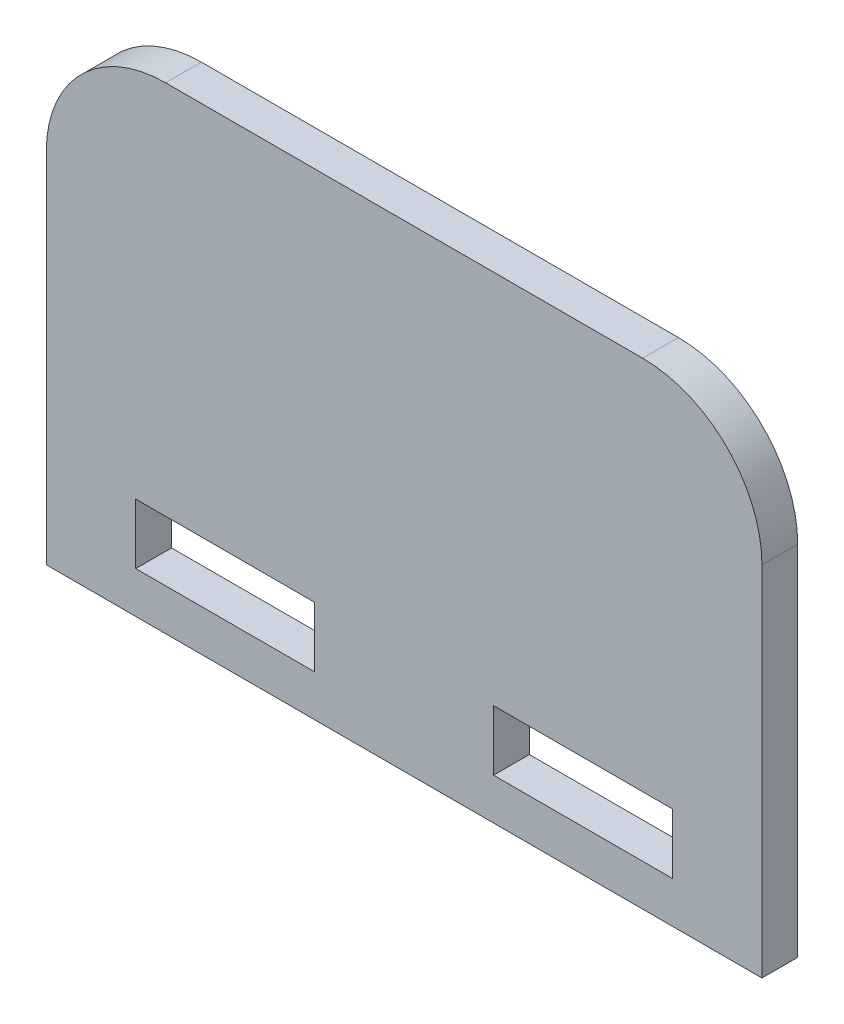
ISO-10303-21;
HEADER;
FILE_DESCRIPTION(('STEP AP214'),'2;1');
FILE_NAME('part.step','',(''),(''),'','','');
FILE_SCHEMA(('AUTOMOTIVE_DESIGN { 1 0 10303 214 1 1 1 1 }'));
ENDSEC;
DATA;
#1=APPLICATION_CONTEXT('core data for automotive mechanical design processes');
#2=APPLICATION_PROTOCOL_DEFINITION('international standard','automotive_design',2000,#1);
#3=PRODUCT_CONTEXT('',#1,'mechanical');
#4=PRODUCT('Part','Part','',(#3));
#5=PRODUCT_RELATED_PRODUCT_CATEGORY('part','',(#4));
#6=PRODUCT_DEFINITION_FORMATION('','',#4);
#7=PRODUCT_DEFINITION_CONTEXT('part definition',#1,'design');
#8=PRODUCT_DEFINITION('design','',#6,#7);
#9=PRODUCT_DEFINITION_SHAPE('','',#8);
#10=(LENGTH_UNIT() NAMED_UNIT(*) SI_UNIT(.MILLI.,.METRE.));
#11=(NAMED_UNIT(*) PLANE_ANGLE_UNIT() SI_UNIT($,.RADIAN.));
#12=(NAMED_UNIT(*) SI_UNIT($,.STERADIAN.) SOLID_ANGLE_UNIT());
#13=UNCERTAINTY_MEASURE_WITH_UNIT(LENGTH_MEASURE(1.E-05),#10,'distance_accuracy_value','');
#14=(GEOMETRIC_REPRESENTATION_CONTEXT(3) GLOBAL_UNCERTAINTY_ASSIGNED_CONTEXT((#13)) GLOBAL_UNIT_ASSIGNED_CONTEXT((#10,
#11,#12)) REPRESENTATION_CONTEXT('',''));
#15=CARTESIAN_POINT('',(0.,0.,0.));
#16=DIRECTION('',(0.,0.,1.));
#17=DIRECTION('',(1.,0.,0.));
#18=AXIS2_PLACEMENT_3D('',#15,#16,#17);
#19=CARTESIAN_POINT('',(-20.,10.,3.));
#20=DIRECTION('',(0.,0.,1.));
#21=DIRECTION('',(1.,0.,0.));
#22=AXIS2_PLACEMENT_3D('',#19,#20,#21);
#23=PLANE('',#22);
#24=DIRECTION('',(0.,1.,0.));
#25=VECTOR('',#24,1.);
#26=CARTESIAN_POINT('',(30.,9.99999999999993,3.));
#27=LINE('',#26,#25);
#28=CARTESIAN_POINT('',(30.,-20.,3.));
#29=VERTEX_POINT('',#28);
#30=CARTESIAN_POINT('',(30.,9.99999999999994,3.));
#31=VERTEX_POINT('',#30);
#32=EDGE_CURVE('E207',#29,#31,#27,.T.);
#33=ORIENTED_EDGE('',*,*,#32,.T.);
#34=CARTESIAN_POINT('',(20.,10.,3.));
#35=DIRECTION('',(0.,0.,1.));
#36=DIRECTION('',(-1.,0.,0.));
#37=AXIS2_PLACEMENT_3D('',#34,#35,#36);
#38=CIRCLE('',#37,10.);
#39=CARTESIAN_POINT('',(19.9999999999999,20.,3.));
#40=VERTEX_POINT('',#39);
#41=EDGE_CURVE('E210',#31,#40,#38,.T.);
#42=ORIENTED_EDGE('',*,*,#41,.T.);
#43=DIRECTION('',(-1.,0.,0.));
#44=VECTOR('',#43,1.);
#45=CARTESIAN_POINT('',(-19.9999999999999,20.,3.));
#46=LINE('',#45,#44);
#47=CARTESIAN_POINT('',(-19.9999999999999,20.,3.));
#48=VERTEX_POINT('',#47);
#49=EDGE_CURVE('E213',#40,#48,#46,.T.);
#50=ORIENTED_EDGE('',*,*,#49,.T.);
#51=CARTESIAN_POINT('',(-20.,10.,3.));
#52=DIRECTION('',(0.,0.,1.));
#53=DIRECTION('',(1.,0.,0.));
#54=AXIS2_PLACEMENT_3D('',#51,#52,#53);
#55=CIRCLE('',#54,10.);
#56=CARTESIAN_POINT('',(-30.,9.99999999999993,3.));
#57=VERTEX_POINT('',#56);
#58=EDGE_CURVE('E215',#48,#57,#55,.T.);
#59=ORIENTED_EDGE('',*,*,#58,.T.);
#60=DIRECTION('',(0.,-1.,0.));
#61=VECTOR('',#60,1.);
#62=CARTESIAN_POINT('',(-30.,9.99999999999993,3.));
#63=LINE('',#62,#61);
#64=CARTESIAN_POINT('',(-30.,-20.,3.));
#65=VERTEX_POINT('',#64);
#66=EDGE_CURVE('E217',#57,#65,#63,.T.);
#67=ORIENTED_EDGE('',*,*,#66,.T.);
#68=DIRECTION('',(1.,0.,0.));
#69=VECTOR('',#68,1.);
#70=CARTESIAN_POINT('',(-30.,-20.,3.));
#71=LINE('',#70,#69);
#72=EDGE_CURVE('E219',#65,#29,#71,.T.);
#73=ORIENTED_EDGE('',*,*,#72,.T.);
#74=EDGE_LOOP('',(#33,#42,#50,#59,#67,#73));
#75=FACE_BOUND('',#74,.T.);
#76=DIRECTION('',(-1.,0.,0.));
#77=VECTOR('',#76,1.);
#78=CARTESIAN_POINT('',(22.5,-11.475,3.));
#79=LINE('',#78,#77);
#80=CARTESIAN_POINT('',(22.5,-11.475,3.));
#81=VERTEX_POINT('',#80);
#82=CARTESIAN_POINT('',(7.49999999999999,-11.475,3.));
#83=VERTEX_POINT('',#82);
#84=EDGE_CURVE('E178',#81,#83,#79,.T.);
#85=ORIENTED_EDGE('',*,*,#84,.F.);
#86=DIRECTION('',(0.,1.,0.));
#87=VECTOR('',#86,1.);
#88=CARTESIAN_POINT('',(22.5,-11.475,3.));
#89=LINE('',#88,#87);
#90=CARTESIAN_POINT('',(22.5,-16.525,3.));
#91=VERTEX_POINT('',#90);
#92=EDGE_CURVE('E176',#91,#81,#89,.T.);
#93=ORIENTED_EDGE('',*,*,#92,.F.);
#94=DIRECTION('',(1.,0.,0.));
#95=VECTOR('',#94,1.);
#96=CARTESIAN_POINT('',(22.5,-16.525,3.));
#97=LINE('',#96,#95);
#98=CARTESIAN_POINT('',(7.5,-16.525,3.));
#99=VERTEX_POINT('',#98);
#100=EDGE_CURVE('E184',#99,#91,#97,.T.);
#101=ORIENTED_EDGE('',*,*,#100,.F.);
#102=DIRECTION('',(0.,-1.,0.));
#103=VECTOR('',#102,1.);
#104=CARTESIAN_POINT('',(7.49999999999999,-11.475,3.));
#105=LINE('',#104,#103);
#106=EDGE_CURVE('E181',#83,#99,#105,.T.);
#107=ORIENTED_EDGE('',*,*,#106,.F.);
#108=EDGE_LOOP('',(#85,#93,#101,#107));
#109=FACE_BOUND('',#108,.T.);
#110=DIRECTION('',(-1.,0.,0.));
#111=VECTOR('',#110,1.);
#112=CARTESIAN_POINT('',(-22.5,-11.475,3.));
#113=LINE('',#112,#111);
#114=CARTESIAN_POINT('',(-7.49999999999999,-11.475,3.));
#115=VERTEX_POINT('',#114);
#116=CARTESIAN_POINT('',(-22.5,-11.475,3.));
#117=VERTEX_POINT('',#116);
#118=EDGE_CURVE('E148',#115,#117,#113,.T.);
#119=ORIENTED_EDGE('',*,*,#118,.F.);
#120=DIRECTION('',(0.,1.,0.));
#121=VECTOR('',#120,1.);
#122=CARTESIAN_POINT('',(-7.49999999999999,-11.475,3.));
#123=LINE('',#122,#121);
#124=CARTESIAN_POINT('',(-7.49999999999999,-16.525,3.));
#125=VERTEX_POINT('',#124);
#126=EDGE_CURVE('E140',#125,#115,#123,.T.);
#127=ORIENTED_EDGE('',*,*,#126,.F.);
#128=DIRECTION('',(1.,0.,0.));
#129=VECTOR('',#128,1.);
#130=CARTESIAN_POINT('',(-22.5,-16.525,3.));
#131=LINE('',#130,#129);
#132=CARTESIAN_POINT('',(-22.5,-16.525,3.));
#133=VERTEX_POINT('',#132);
#134=EDGE_CURVE('E162',#133,#125,#131,.T.);
#135=ORIENTED_EDGE('',*,*,#134,.F.);
#136=DIRECTION('',(0.,-1.,0.));
#137=VECTOR('',#136,1.);
#138=CARTESIAN_POINT('',(-22.5,-11.475,3.));
#139=LINE('',#138,#137);
#140=EDGE_CURVE('E160',#117,#133,#139,.T.);
#141=ORIENTED_EDGE('',*,*,#140,.F.);
#142=EDGE_LOOP('',(#119,#127,#135,#141));
#143=FACE_BOUND('',#142,.T.);
#144=ADVANCED_FACE('F39',(#75,#109,#143),#23,.T.);
#145=CARTESIAN_POINT('',(-20.,10.,0.));
#146=DIRECTION('',(0.,0.,1.));
#147=DIRECTION('',(1.,0.,0.));
#148=AXIS2_PLACEMENT_3D('',#145,#146,#147);
#149=PLANE('',#148);
#150=DIRECTION('',(0.,1.,0.));
#151=VECTOR('',#150,1.);
#152=CARTESIAN_POINT('',(22.5,-11.475,0.));
#153=LINE('',#152,#151);
#154=CARTESIAN_POINT('',(22.5,-16.525,0.));
#155=VERTEX_POINT('',#154);
#156=CARTESIAN_POINT('',(22.5,-11.475,0.));
#157=VERTEX_POINT('',#156);
#158=EDGE_CURVE('E156',#155,#157,#153,.T.);
#159=ORIENTED_EDGE('',*,*,#158,.T.);
#160=DIRECTION('',(-1.,0.,0.));
#161=VECTOR('',#160,1.);
#162=CARTESIAN_POINT('',(22.5,-11.475,0.));
#163=LINE('',#162,#161);
#164=CARTESIAN_POINT('',(7.49999999999999,-11.475,0.));
#165=VERTEX_POINT('',#164);
#166=EDGE_CURVE('E189',#157,#165,#163,.T.);
#167=ORIENTED_EDGE('',*,*,#166,.T.);
#168=DIRECTION('',(0.,-1.,0.));
#169=VECTOR('',#168,1.);
#170=CARTESIAN_POINT('',(7.49999999999999,-11.475,0.));
#171=LINE('',#170,#169);
#172=CARTESIAN_POINT('',(7.5,-16.525,0.));
#173=VERTEX_POINT('',#172);
#174=EDGE_CURVE('E192',#165,#173,#171,.T.);
#175=ORIENTED_EDGE('',*,*,#174,.T.);
#176=DIRECTION('',(1.,0.,0.));
#177=VECTOR('',#176,1.);
#178=CARTESIAN_POINT('',(22.5,-16.525,0.));
#179=LINE('',#178,#177);
#180=EDGE_CURVE('E179',#173,#155,#179,.T.);
#181=ORIENTED_EDGE('',*,*,#180,.T.);
#182=EDGE_LOOP('',(#159,#167,#175,#181));
#183=FACE_BOUND('',#182,.T.);
#184=DIRECTION('',(0.,1.,0.));
#185=VECTOR('',#184,1.);
#186=CARTESIAN_POINT('',(30.,9.99999999999993,0.));
#187=LINE('',#186,#185);
#188=CARTESIAN_POINT('',(30.,-20.,0.));
#189=VERTEX_POINT('',#188);
#190=CARTESIAN_POINT('',(30.,9.99999999999994,0.));
#191=VERTEX_POINT('',#190);
#192=EDGE_CURVE('E206',#189,#191,#187,.T.);
#193=ORIENTED_EDGE('',*,*,#192,.F.);
#194=DIRECTION('',(1.,0.,0.));
#195=VECTOR('',#194,1.);
#196=CARTESIAN_POINT('',(-30.,-20.,0.));
#197=LINE('',#196,#195);
#198=CARTESIAN_POINT('',(-30.,-20.,0.));
#199=VERTEX_POINT('',#198);
#200=EDGE_CURVE('E211',#199,#189,#197,.T.);
#201=ORIENTED_EDGE('',*,*,#200,.F.);
#202=DIRECTION('',(0.,-1.,0.));
#203=VECTOR('',#202,1.);
#204=CARTESIAN_POINT('',(-30.,9.99999999999993,0.));
#205=LINE('',#204,#203);
#206=CARTESIAN_POINT('',(-30.,9.99999999999993,0.));
#207=VERTEX_POINT('',#206);
#208=EDGE_CURVE('E230',#207,#199,#205,.T.);
#209=ORIENTED_EDGE('',*,*,#208,.F.);
#210=CARTESIAN_POINT('',(-20.,10.,0.));
#211=DIRECTION('',(0.,0.,1.));
#212=DIRECTION('',(1.,0.,0.));
#213=AXIS2_PLACEMENT_3D('',#210,#211,#212);
#214=CIRCLE('',#213,10.);
#215=CARTESIAN_POINT('',(-19.9999999999999,20.,0.));
#216=VERTEX_POINT('',#215);
#217=EDGE_CURVE('E228',#216,#207,#214,.T.);
#218=ORIENTED_EDGE('',*,*,#217,.F.);
#219=DIRECTION('',(-1.,0.,0.));
#220=VECTOR('',#219,1.);
#221=CARTESIAN_POINT('',(-19.9999999999999,20.,0.));
#222=LINE('',#221,#220);
#223=CARTESIAN_POINT('',(19.9999999999999,20.,0.));
#224=VERTEX_POINT('',#223);
#225=EDGE_CURVE('E226',#224,#216,#222,.T.);
#226=ORIENTED_EDGE('',*,*,#225,.F.);
#227=CARTESIAN_POINT('',(20.,10.,0.));
#228=DIRECTION('',(0.,0.,1.));
#229=DIRECTION('',(-1.,0.,0.));
#230=AXIS2_PLACEMENT_3D('',#227,#228,#229);
#231=CIRCLE('',#230,10.);
#232=EDGE_CURVE('E224',#191,#224,#231,.T.);
#233=ORIENTED_EDGE('',*,*,#232,.F.);
#234=EDGE_LOOP('',(#193,#201,#209,#218,#226,#233));
#235=FACE_BOUND('',#234,.T.);
#236=DIRECTION('',(0.,1.,0.));
#237=VECTOR('',#236,1.);
#238=CARTESIAN_POINT('',(-7.49999999999999,-11.475,0.));
#239=LINE('',#238,#237);
#240=CARTESIAN_POINT('',(-7.49999999999999,-16.525,0.));
#241=VERTEX_POINT('',#240);
#242=CARTESIAN_POINT('',(-7.49999999999999,-11.475,0.));
#243=VERTEX_POINT('',#242);
#244=EDGE_CURVE('E62',#241,#243,#239,.T.);
#245=ORIENTED_EDGE('',*,*,#244,.T.);
#246=DIRECTION('',(-1.,0.,0.));
#247=VECTOR('',#246,1.);
#248=CARTESIAN_POINT('',(-22.5,-11.475,0.));
#249=LINE('',#248,#247);
#250=CARTESIAN_POINT('',(-22.5,-11.475,0.));
#251=VERTEX_POINT('',#250);
#252=EDGE_CURVE('E155',#243,#251,#249,.T.);
#253=ORIENTED_EDGE('',*,*,#252,.T.);
#254=DIRECTION('',(0.,-1.,0.));
#255=VECTOR('',#254,1.);
#256=CARTESIAN_POINT('',(-22.5,-11.475,0.));
#257=LINE('',#256,#255);
#258=CARTESIAN_POINT('',(-22.5,-16.525,0.));
#259=VERTEX_POINT('',#258);
#260=EDGE_CURVE('E168',#251,#259,#257,.T.);
#261=ORIENTED_EDGE('',*,*,#260,.T.);
#262=DIRECTION('',(1.,0.,0.));
#263=VECTOR('',#262,1.);
#264=CARTESIAN_POINT('',(-22.5,-16.525,0.));
#265=LINE('',#264,#263);
#266=EDGE_CURVE('E149',#259,#241,#265,.T.);
#267=ORIENTED_EDGE('',*,*,#266,.T.);
#268=EDGE_LOOP('',(#245,#253,#261,#267));
#269=FACE_BOUND('',#268,.T.);
#270=ADVANCED_FACE('F254',(#183,#235,#269),#149,.F.);
#271=CARTESIAN_POINT('',(30.,9.99999999999993,3.));
#272=DIRECTION('',(-1.,0.,0.));
#273=DIRECTION('',(0.,-1.,0.));
#274=AXIS2_PLACEMENT_3D('',#271,#272,#273);
#275=PLANE('',#274);
#276=ORIENTED_EDGE('',*,*,#192,.T.);
#277=DIRECTION('',(0.,0.,-1.));
#278=VECTOR('',#277,1.);
#279=CARTESIAN_POINT('',(30.,9.99999999999994,3.));
#280=LINE('',#279,#278);
#281=EDGE_CURVE('E11',#31,#191,#280,.T.);
#282=ORIENTED_EDGE('',*,*,#281,.F.);
#283=ORIENTED_EDGE('',*,*,#32,.F.);
#284=DIRECTION('',(0.,0.,-1.));
#285=VECTOR('',#284,1.);
#286=CARTESIAN_POINT('',(30.,-20.,3.));
#287=LINE('',#286,#285);
#288=EDGE_CURVE('E221',#29,#189,#287,.T.);
#289=ORIENTED_EDGE('',*,*,#288,.T.);
#290=EDGE_LOOP('',(#276,#282,#283,#289));
#291=FACE_BOUND('',#290,.T.);
#292=ADVANCED_FACE('F41',(#291),#275,.F.);
#293=CARTESIAN_POINT('',(20.,10.,3.));
#294=DIRECTION('',(0.,0.,-1.));
#295=DIRECTION('',(-1.,0.,0.));
#296=AXIS2_PLACEMENT_3D('',#293,#294,#295);
#297=CYLINDRICAL_SURFACE('',#296,10.);
#298=ORIENTED_EDGE('',*,*,#232,.T.);
#299=DIRECTION('',(0.,0.,-1.));
#300=VECTOR('',#299,1.);
#301=CARTESIAN_POINT('',(19.9999999999999,20.,3.));
#302=LINE('',#301,#300);
#303=EDGE_CURVE('E47',#40,#224,#302,.T.);
#304=ORIENTED_EDGE('',*,*,#303,.F.);
#305=ORIENTED_EDGE('',*,*,#41,.F.);
#306=ORIENTED_EDGE('',*,*,#281,.T.);
#307=EDGE_LOOP('',(#298,#304,#305,#306));
#308=FACE_BOUND('',#307,.T.);
#309=ADVANCED_FACE('F272',(#308),#297,.T.);
#310=CARTESIAN_POINT('',(-19.9999999999999,20.,3.));
#311=DIRECTION('',(0.,-1.,0.));
#312=DIRECTION('',(0.,0.,-1.));
#313=AXIS2_PLACEMENT_3D('',#310,#311,#312);
#314=PLANE('',#313);
#315=ORIENTED_EDGE('',*,*,#225,.T.);
#316=DIRECTION('',(0.,0.,-1.));
#317=VECTOR('',#316,1.);
#318=CARTESIAN_POINT('',(-19.9999999999999,20.,3.));
#319=LINE('',#318,#317);
#320=EDGE_CURVE('E241',#48,#216,#319,.T.);
#321=ORIENTED_EDGE('',*,*,#320,.F.);
#322=ORIENTED_EDGE('',*,*,#49,.F.);
#323=ORIENTED_EDGE('',*,*,#303,.T.);
#324=EDGE_LOOP('',(#315,#321,#322,#323));
#325=FACE_BOUND('',#324,.T.);
#326=ADVANCED_FACE('F248',(#325),#314,.F.);
#327=CARTESIAN_POINT('',(-20.,10.,3.));
#328=DIRECTION('',(0.,0.,-1.));
#329=DIRECTION('',(-1.,0.,0.));
#330=AXIS2_PLACEMENT_3D('',#327,#328,#329);
#331=CYLINDRICAL_SURFACE('',#330,10.);
#332=ORIENTED_EDGE('',*,*,#217,.T.);
#333=DIRECTION('',(0.,0.,-1.));
#334=VECTOR('',#333,1.);
#335=CARTESIAN_POINT('',(-30.,9.99999999999993,3.));
#336=LINE('',#335,#334);
#337=EDGE_CURVE('E238',#57,#207,#336,.T.);
#338=ORIENTED_EDGE('',*,*,#337,.F.);
#339=ORIENTED_EDGE('',*,*,#58,.F.);
#340=ORIENTED_EDGE('',*,*,#320,.T.);
#341=EDGE_LOOP('',(#332,#338,#339,#340));
#342=FACE_BOUND('',#341,.T.);
#343=ADVANCED_FACE('F260',(#342),#331,.T.);
#344=CARTESIAN_POINT('',(-30.,9.99999999999993,3.));
#345=DIRECTION('',(1.,0.,0.));
#346=DIRECTION('',(0.,1.,0.));
#347=AXIS2_PLACEMENT_3D('',#344,#345,#346);
#348=PLANE('',#347);
#349=ORIENTED_EDGE('',*,*,#208,.T.);
#350=DIRECTION('',(0.,0.,-1.));
#351=VECTOR('',#350,1.);
#352=CARTESIAN_POINT('',(-30.,-20.,3.));
#353=LINE('',#352,#351);
#354=EDGE_CURVE('E235',#65,#199,#353,.T.);
#355=ORIENTED_EDGE('',*,*,#354,.F.);
#356=ORIENTED_EDGE('',*,*,#66,.F.);
#357=ORIENTED_EDGE('',*,*,#337,.T.);
#358=EDGE_LOOP('',(#349,#355,#356,#357));
#359=FACE_BOUND('',#358,.T.);
#360=ADVANCED_FACE('F264',(#359),#348,.F.);
#361=CARTESIAN_POINT('',(-30.,-20.,3.));
#362=DIRECTION('',(0.,1.,0.));
#363=DIRECTION('',(0.,0.,1.));
#364=AXIS2_PLACEMENT_3D('',#361,#362,#363);
#365=PLANE('',#364);
#366=ORIENTED_EDGE('',*,*,#200,.T.);
#367=ORIENTED_EDGE('',*,*,#288,.F.);
#368=ORIENTED_EDGE('',*,*,#72,.F.);
#369=ORIENTED_EDGE('',*,*,#354,.T.);
#370=EDGE_LOOP('',(#366,#367,#368,#369));
#371=FACE_BOUND('',#370,.T.);
#372=ADVANCED_FACE('F275',(#371),#365,.F.);
#373=CARTESIAN_POINT('',(22.5,-11.475,3.));
#374=DIRECTION('',(-1.,0.,0.));
#375=DIRECTION('',(0.,-1.,0.));
#376=AXIS2_PLACEMENT_3D('',#373,#374,#375);
#377=PLANE('',#376);
#378=ORIENTED_EDGE('',*,*,#158,.F.);
#379=DIRECTION('',(0.,0.,-1.));
#380=VECTOR('',#379,1.);
#381=CARTESIAN_POINT('',(22.5,-16.525,3.));
#382=LINE('',#381,#380);
#383=EDGE_CURVE('E186',#91,#155,#382,.T.);
#384=ORIENTED_EDGE('',*,*,#383,.F.);
#385=ORIENTED_EDGE('',*,*,#92,.T.);
#386=DIRECTION('',(0.,0.,-1.));
#387=VECTOR('',#386,1.);
#388=CARTESIAN_POINT('',(22.5,-11.475,3.));
#389=LINE('',#388,#387);
#390=EDGE_CURVE('E203',#81,#157,#389,.T.);
#391=ORIENTED_EDGE('',*,*,#390,.T.);
#392=EDGE_LOOP('',(#378,#384,#385,#391));
#393=FACE_BOUND('',#392,.T.);
#394=ADVANCED_FACE('F277',(#393),#377,.T.);
#395=CARTESIAN_POINT('',(22.5,-11.475,3.));
#396=DIRECTION('',(0.,-1.,0.));
#397=DIRECTION('',(1.,0.,0.));
#398=AXIS2_PLACEMENT_3D('',#395,#396,#397);
#399=PLANE('',#398);
#400=ORIENTED_EDGE('',*,*,#166,.F.);
#401=ORIENTED_EDGE('',*,*,#390,.F.);
#402=ORIENTED_EDGE('',*,*,#84,.T.);
#403=DIRECTION('',(0.,0.,-1.));
#404=VECTOR('',#403,1.);
#405=CARTESIAN_POINT('',(7.49999999999999,-11.475,3.));
#406=LINE('',#405,#404);
#407=EDGE_CURVE('E201',#83,#165,#406,.T.);
#408=ORIENTED_EDGE('',*,*,#407,.T.);
#409=EDGE_LOOP('',(#400,#401,#402,#408));
#410=FACE_BOUND('',#409,.T.);
#411=ADVANCED_FACE('F283',(#410),#399,.T.);
#412=CARTESIAN_POINT('',(7.49999999999999,-11.475,3.));
#413=DIRECTION('',(1.,0.,0.));
#414=DIRECTION('',(0.,1.,0.));
#415=AXIS2_PLACEMENT_3D('',#412,#413,#414);
#416=PLANE('',#415);
#417=ORIENTED_EDGE('',*,*,#174,.F.);
#418=ORIENTED_EDGE('',*,*,#407,.F.);
#419=ORIENTED_EDGE('',*,*,#106,.T.);
#420=DIRECTION('',(0.,0.,-1.));
#421=VECTOR('',#420,1.);
#422=CARTESIAN_POINT('',(7.5,-16.525,3.));
#423=LINE('',#422,#421);
#424=EDGE_CURVE('E199',#99,#173,#423,.T.);
#425=ORIENTED_EDGE('',*,*,#424,.T.);
#426=EDGE_LOOP('',(#417,#418,#419,#425));
#427=FACE_BOUND('',#426,.T.);
#428=ADVANCED_FACE('F297',(#427),#416,.T.);
#429=CARTESIAN_POINT('',(22.5,-16.525,3.));
#430=DIRECTION('',(0.,1.,0.));
#431=DIRECTION('',(-1.,0.,0.));
#432=AXIS2_PLACEMENT_3D('',#429,#430,#431);
#433=PLANE('',#432);
#434=ORIENTED_EDGE('',*,*,#180,.F.);
#435=ORIENTED_EDGE('',*,*,#424,.F.);
#436=ORIENTED_EDGE('',*,*,#100,.T.);
#437=ORIENTED_EDGE('',*,*,#383,.T.);
#438=EDGE_LOOP('',(#434,#435,#436,#437));
#439=FACE_BOUND('',#438,.T.);
#440=ADVANCED_FACE('F301',(#439),#433,.T.);
#441=CARTESIAN_POINT('',(-7.49999999999999,-11.475,3.));
#442=DIRECTION('',(-1.,0.,0.));
#443=DIRECTION('',(0.,0.,1.));
#444=AXIS2_PLACEMENT_3D('',#441,#442,#443);
#445=PLANE('',#444);
#446=ORIENTED_EDGE('',*,*,#244,.F.);
#447=DIRECTION('',(0.,0.,-1.));
#448=VECTOR('',#447,1.);
#449=CARTESIAN_POINT('',(-7.49999999999999,-16.525,3.));
#450=LINE('',#449,#448);
#451=EDGE_CURVE('E144',#125,#241,#450,.T.);
#452=ORIENTED_EDGE('',*,*,#451,.F.);
#453=ORIENTED_EDGE('',*,*,#126,.T.);
#454=DIRECTION('',(0.,0.,-1.));
#455=VECTOR('',#454,1.);
#456=CARTESIAN_POINT('',(-7.49999999999999,-11.475,3.));
#457=LINE('',#456,#455);
#458=EDGE_CURVE('E143',#115,#243,#457,.T.);
#459=ORIENTED_EDGE('',*,*,#458,.T.);
#460=EDGE_LOOP('',(#446,#452,#453,#459));
#461=FACE_BOUND('',#460,.T.);
#462=ADVANCED_FACE('F142',(#461),#445,.T.);
#463=CARTESIAN_POINT('',(-22.5,-11.475,3.));
#464=DIRECTION('',(0.,-1.,0.));
#465=DIRECTION('',(0.,0.,-1.));
#466=AXIS2_PLACEMENT_3D('',#463,#464,#465);
#467=PLANE('',#466);
#468=ORIENTED_EDGE('',*,*,#252,.F.);
#469=ORIENTED_EDGE('',*,*,#458,.F.);
#470=ORIENTED_EDGE('',*,*,#118,.T.);
#471=DIRECTION('',(0.,0.,-1.));
#472=VECTOR('',#471,1.);
#473=CARTESIAN_POINT('',(-22.5,-11.475,3.));
#474=LINE('',#473,#472);
#475=EDGE_CURVE('E157',#117,#251,#474,.T.);
#476=ORIENTED_EDGE('',*,*,#475,.T.);
#477=EDGE_LOOP('',(#468,#469,#470,#476));
#478=FACE_BOUND('',#477,.T.);
#479=ADVANCED_FACE('F152',(#478),#467,.T.);
#480=CARTESIAN_POINT('',(-22.5,-11.475,3.));
#481=DIRECTION('',(1.,0.,0.));
#482=DIRECTION('',(0.,1.,0.));
#483=AXIS2_PLACEMENT_3D('',#480,#481,#482);
#484=PLANE('',#483);
#485=ORIENTED_EDGE('',*,*,#260,.F.);
#486=ORIENTED_EDGE('',*,*,#475,.F.);
#487=ORIENTED_EDGE('',*,*,#140,.T.);
#488=DIRECTION('',(0.,0.,-1.));
#489=VECTOR('',#488,1.);
#490=CARTESIAN_POINT('',(-22.5,-16.525,3.));
#491=LINE('',#490,#489);
#492=EDGE_CURVE('E54',#133,#259,#491,.T.);
#493=ORIENTED_EDGE('',*,*,#492,.T.);
#494=EDGE_LOOP('',(#485,#486,#487,#493));
#495=FACE_BOUND('',#494,.T.);
#496=ADVANCED_FACE('F310',(#495),#484,.T.);
#497=CARTESIAN_POINT('',(-22.5,-16.525,3.));
#498=DIRECTION('',(0.,1.,0.));
#499=DIRECTION('',(0.,0.,1.));
#500=AXIS2_PLACEMENT_3D('',#497,#498,#499);
#501=PLANE('',#500);
#502=ORIENTED_EDGE('',*,*,#266,.F.);
#503=ORIENTED_EDGE('',*,*,#492,.F.);
#504=ORIENTED_EDGE('',*,*,#134,.T.);
#505=ORIENTED_EDGE('',*,*,#451,.T.);
#506=EDGE_LOOP('',(#502,#503,#504,#505));
#507=FACE_BOUND('',#506,.T.);
#508=ADVANCED_FACE('F313',(#507),#501,.T.);
#509=CLOSED_SHELL('',(#144,#270,#292,#309,#326,#343,#360,#372,#394,#411,#428,#440,#462,#479,
#496,#508));
#510=MANIFOLD_SOLID_BREP('B2',#509);
#511=ADVANCED_BREP_SHAPE_REPRESENTATION('',(#18,#510),#14);
#512=SHAPE_DEFINITION_REPRESENTATION(#9,#511);
ENDSEC;
END-ISO-10303-21;
